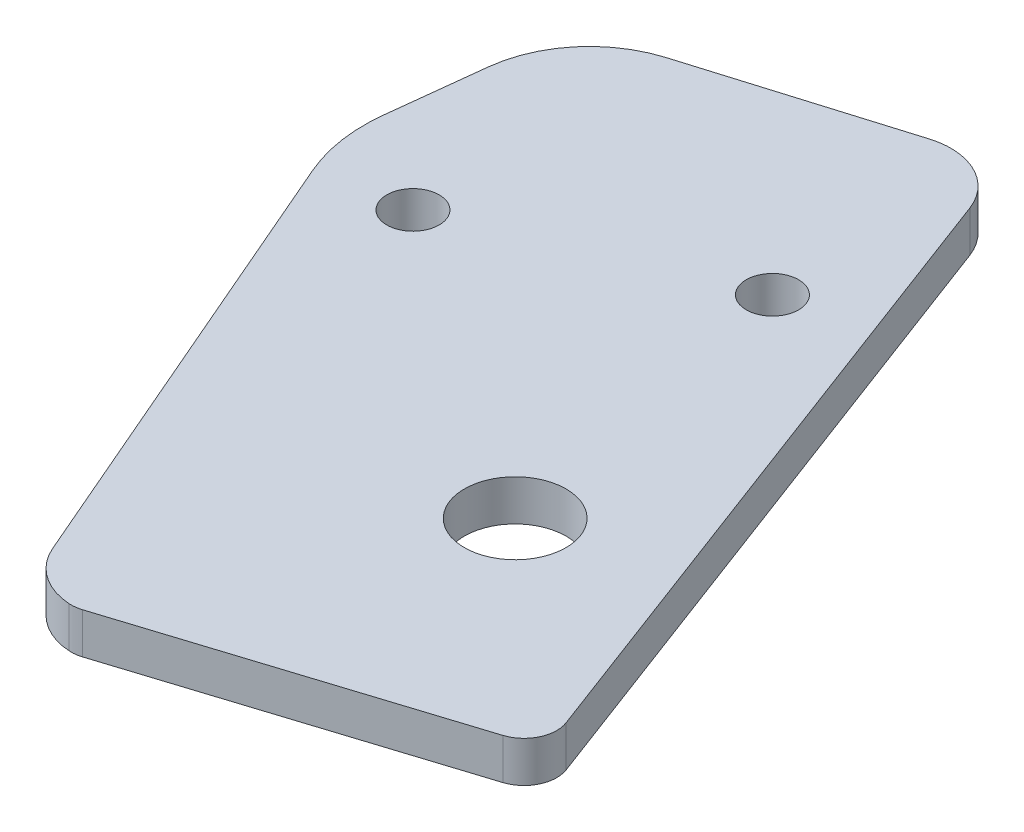
ISO-10303-21;
HEADER;
FILE_DESCRIPTION(('STEP AP214'),'2;1');
FILE_NAME('part.step','',(''),(''),'','','');
FILE_SCHEMA(('AUTOMOTIVE_DESIGN { 1 0 10303 214 1 1 1 1 }'));
ENDSEC;
DATA;
#1=APPLICATION_CONTEXT('core data for automotive mechanical design processes');
#2=APPLICATION_PROTOCOL_DEFINITION('international standard','automotive_design',2000,#1);
#3=PRODUCT_CONTEXT('',#1,'mechanical');
#4=PRODUCT('Part','Part','',(#3));
#5=PRODUCT_RELATED_PRODUCT_CATEGORY('part','',(#4));
#6=PRODUCT_DEFINITION_FORMATION('','',#4);
#7=PRODUCT_DEFINITION_CONTEXT('part definition',#1,'design');
#8=PRODUCT_DEFINITION('design','',#6,#7);
#9=PRODUCT_DEFINITION_SHAPE('','',#8);
#10=(LENGTH_UNIT() NAMED_UNIT(*) SI_UNIT(.MILLI.,.METRE.));
#11=(NAMED_UNIT(*) PLANE_ANGLE_UNIT() SI_UNIT($,.RADIAN.));
#12=(NAMED_UNIT(*) SI_UNIT($,.STERADIAN.) SOLID_ANGLE_UNIT());
#13=UNCERTAINTY_MEASURE_WITH_UNIT(LENGTH_MEASURE(1.E-05),#10,'distance_accuracy_value','');
#14=(GEOMETRIC_REPRESENTATION_CONTEXT(3) GLOBAL_UNCERTAINTY_ASSIGNED_CONTEXT((#13)) GLOBAL_UNIT_ASSIGNED_CONTEXT((#10,
#11,#12)) REPRESENTATION_CONTEXT('',''));
#15=CARTESIAN_POINT('',(0.,0.,0.));
#16=DIRECTION('',(0.,0.,1.));
#17=DIRECTION('',(1.,0.,0.));
#18=AXIS2_PLACEMENT_3D('',#15,#16,#17);
#19=CARTESIAN_POINT('',(0.,3.175,0.));
#20=DIRECTION('',(0.,1.,0.));
#21=DIRECTION('',(0.,0.,1.));
#22=AXIS2_PLACEMENT_3D('',#19,#20,#21);
#23=PLANE('',#22);
#24=CARTESIAN_POINT('',(-2.72391143677525,3.175,-9.48512316381565));
#25=DIRECTION('',(0.,-1.,0.));
#26=DIRECTION('',(0.,0.,-1.));
#27=AXIS2_PLACEMENT_3D('',#24,#25,#26);
#28=CIRCLE('',#27,3.95);
#29=CARTESIAN_POINT('',(-2.72391143677525,3.175,-13.4351231638156));
#30=VERTEX_POINT('',#29);
#31=EDGE_CURVE('E183',#30,#30,#28,.T.);
#32=ORIENTED_EDGE('',*,*,#31,.T.);
#33=EDGE_LOOP('',(#32));
#34=FACE_BOUND('',#33,.T.);
#35=CARTESIAN_POINT('',(-27.4348242736929,3.175,-26.2566941503502));
#36=DIRECTION('',(0.,-1.,0.));
#37=DIRECTION('',(0.,0.,-1.));
#38=AXIS2_PLACEMENT_3D('',#35,#36,#37);
#39=CIRCLE('',#38,2.032);
#40=CARTESIAN_POINT('',(-27.4348242736929,3.175,-28.2886941503502));
#41=VERTEX_POINT('',#40);
#42=EDGE_CURVE('E174',#41,#41,#39,.T.);
#43=ORIENTED_EDGE('',*,*,#42,.T.);
#44=EDGE_LOOP('',(#43));
#45=FACE_BOUND('',#44,.T.);
#46=CARTESIAN_POINT('',(-7.76493640593196,3.175,-34.5070552051682));
#47=DIRECTION('',(0.,-1.,0.));
#48=DIRECTION('',(0.,0.,-1.));
#49=AXIS2_PLACEMENT_3D('',#46,#47,#48);
#50=CIRCLE('',#49,2.03199999999999);
#51=CARTESIAN_POINT('',(-7.76493640593196,3.175,-36.5390552051682));
#52=VERTEX_POINT('',#51);
#53=EDGE_CURVE('E138',#52,#52,#50,.T.);
#54=ORIENTED_EDGE('',*,*,#53,.T.);
#55=EDGE_LOOP('',(#54));
#56=FACE_BOUND('',#55,.T.);
#57=DIRECTION('',(0.9530618054394,0.,-0.302775816426266));
#58=VECTOR('',#57,1.);
#59=CARTESIAN_POINT('',(2.66086977695026,3.175,8.37574606714643));
#60=LINE('',#59,#58);
#61=CARTESIAN_POINT('',(-13.3730568373587,3.175,13.4695240293513));
#62=VERTEX_POINT('',#61);
#63=CARTESIAN_POINT('',(11.3976631095826,3.175,5.60017608927313));
#64=VERTEX_POINT('',#63);
#65=EDGE_CURVE('E139',#62,#64,#60,.T.);
#66=ORIENTED_EDGE('',*,*,#65,.T.);
#67=CARTESIAN_POINT('',(10.6286125358599,3.175,3.17939910345706));
#68=DIRECTION('',(0.,1.,0.));
#69=DIRECTION('',(0.,0.,1.));
#70=AXIS2_PLACEMENT_3D('',#67,#68,#69);
#71=CIRCLE('',#70,2.54);
#72=CARTESIAN_POINT('',(13.0056344324065,3.175,2.28420811638324));
#73=VERTEX_POINT('',#72);
#74=EDGE_CURVE('E12',#64,#73,#71,.T.);
#75=ORIENTED_EDGE('',*,*,#74,.T.);
#76=DIRECTION('',(0.352437396485755,0.,0.935835392341166));
#77=VECTOR('',#76,1.);
#78=CARTESIAN_POINT('',(10.6367917652594,3.175,-4.0058360983023));
#79=LINE('',#78,#77);
#80=CARTESIAN_POINT('',(-5.93429697501374,3.175,-48.0074417377896));
#81=VERTEX_POINT('',#80);
#82=EDGE_CURVE('E175',#81,#73,#79,.T.);
#83=ORIENTED_EDGE('',*,*,#82,.F.);
#84=CARTESIAN_POINT('',(-10.6883407681069,3.175,-46.217059763642));
#85=DIRECTION('',(0.,-1.,0.));
#86=DIRECTION('',(0.,0.,-1.));
#87=AXIS2_PLACEMENT_3D('',#84,#85,#86);
#88=CIRCLE('',#87,5.08);
#89=CARTESIAN_POINT('',(-12.1585230397021,3.175,-51.0796685375705));
#90=VERTEX_POINT('',#89);
#91=EDGE_CURVE('E169',#90,#81,#88,.T.);
#92=ORIENTED_EDGE('',*,*,#91,.F.);
#93=DIRECTION('',(0.957206451560739,0.,-0.289405958975449));
#94=VECTOR('',#93,1.);
#95=CARTESIAN_POINT('',(-15.1685006161055,3.175,-50.1696188345276));
#96=LINE('',#95,#94);
#97=CARTESIAN_POINT('',(-27.8632506559036,3.175,-46.3314329309214));
#98=VERTEX_POINT('',#97);
#99=EDGE_CURVE('E168',#98,#90,#96,.T.);
#100=ORIENTED_EDGE('',*,*,#99,.F.);
#101=CARTESIAN_POINT('',(-25.2904316806118,3.175,-37.8218675765464));
#102=DIRECTION('',(0.,-1.,0.));
#103=DIRECTION('',(0.,0.,-1.));
#104=AXIS2_PLACEMENT_3D('',#101,#102,#103);
#105=CIRCLE('',#104,8.89);
#106=CARTESIAN_POINT('',(-34.123437376859,3.175,-38.8269100483179));
#107=VERTEX_POINT('',#106);
#108=EDGE_CURVE('E161',#107,#98,#105,.T.);
#109=ORIENTED_EDGE('',*,*,#108,.F.);
#110=DIRECTION('',(0.113053146430997,0.,-0.993588942210033));
#111=VECTOR('',#110,1.);
#112=CARTESIAN_POINT('',(-38.0486682299339,3.175,-4.32927690533198));
#113=LINE('',#112,#111);
#114=CARTESIAN_POINT('',(-34.9557957747417,3.175,-31.5115709693066));
#115=VERTEX_POINT('',#114);
#116=EDGE_CURVE('E159',#115,#107,#113,.T.);
#117=ORIENTED_EDGE('',*,*,#116,.F.);
#118=CARTESIAN_POINT('',(-22.3372162086743,3.175,-30.075796009633));
#119=DIRECTION('',(0.,-1.,0.));
#120=DIRECTION('',(0.,0.,-1.));
#121=AXIS2_PLACEMENT_3D('',#118,#119,#120);
#122=CIRCLE('',#121,12.7);
#123=CARTESIAN_POINT('',(-33.9977824734721,3.175,-25.0437790795881));
#124=VERTEX_POINT('',#123);
#125=EDGE_CURVE('E160',#124,#115,#122,.T.);
#126=ORIENTED_EDGE('',*,*,#125,.F.);
#127=DIRECTION('',(-0.39622180551535,0.,-0.918154823999829));
#128=VECTOR('',#127,1.);
#129=CARTESIAN_POINT('',(-19.5496615813976,3.175,8.43648805900831));
#130=LINE('',#129,#128);
#131=CARTESIAN_POINT('',(-18.6477304273271,3.175,10.5265104366221));
#132=VERTEX_POINT('',#131);
#133=EDGE_CURVE('E153',#132,#124,#130,.T.);
#134=ORIENTED_EDGE('',*,*,#133,.F.);
#135=CARTESIAN_POINT('',(-13.9835039214079,3.175,8.51370366460409));
#136=DIRECTION('',(0.,-1.,0.));
#137=DIRECTION('',(0.,0.,-1.));
#138=AXIS2_PLACEMENT_3D('',#135,#136,#137);
#139=CIRCLE('',#138,5.08000000000001);
#140=CARTESIAN_POINT('',(-14.3007109007549,3.175,13.5837904224667));
#141=VERTEX_POINT('',#140);
#142=EDGE_CURVE('E148',#141,#132,#139,.T.);
#143=ORIENTED_EDGE('',*,*,#142,.F.);
#144=CARTESIAN_POINT('',(-14.1421074110814,3.175,11.0487470435354));
#145=DIRECTION('',(0.,-1.,0.));
#146=DIRECTION('',(0.,0.,-1.));
#147=AXIS2_PLACEMENT_3D('',#144,#145,#146);
#148=CIRCLE('',#147,2.54);
#149=EDGE_CURVE('E134',#62,#141,#148,.T.);
#150=ORIENTED_EDGE('',*,*,#149,.F.);
#151=EDGE_LOOP('',(#66,#75,#83,#92,#100,#109,#117,#126,#134,#143,#150));
#152=FACE_BOUND('',#151,.T.);
#153=ADVANCED_FACE('F48',(#34,#45,#56,#152),#23,.T.);
#154=CARTESIAN_POINT('',(0.,0.,0.));
#155=DIRECTION('',(0.,1.,0.));
#156=DIRECTION('',(0.,0.,1.));
#157=AXIS2_PLACEMENT_3D('',#154,#155,#156);
#158=PLANE('',#157);
#159=CARTESIAN_POINT('',(-7.76493640593196,0.,-34.5070552051682));
#160=DIRECTION('',(0.,-1.,0.));
#161=DIRECTION('',(0.,0.,-1.));
#162=AXIS2_PLACEMENT_3D('',#159,#160,#161);
#163=CIRCLE('',#162,2.03199999999999);
#164=CARTESIAN_POINT('',(-7.76493640593196,0.,-36.5390552051682));
#165=VERTEX_POINT('',#164);
#166=EDGE_CURVE('E144',#165,#165,#163,.T.);
#167=ORIENTED_EDGE('',*,*,#166,.F.);
#168=EDGE_LOOP('',(#167));
#169=FACE_BOUND('',#168,.T.);
#170=CARTESIAN_POINT('',(-27.4348242736929,0.,-26.2566941503502));
#171=DIRECTION('',(0.,-1.,0.));
#172=DIRECTION('',(0.,0.,-1.));
#173=AXIS2_PLACEMENT_3D('',#170,#171,#172);
#174=CIRCLE('',#173,2.032);
#175=CARTESIAN_POINT('',(-27.4348242736929,0.,-28.2886941503502));
#176=VERTEX_POINT('',#175);
#177=EDGE_CURVE('E235',#176,#176,#174,.T.);
#178=ORIENTED_EDGE('',*,*,#177,.F.);
#179=EDGE_LOOP('',(#178));
#180=FACE_BOUND('',#179,.T.);
#181=CARTESIAN_POINT('',(-2.72391143677525,0.,-9.48512316381565));
#182=DIRECTION('',(0.,-1.,0.));
#183=DIRECTION('',(0.,0.,-1.));
#184=AXIS2_PLACEMENT_3D('',#181,#182,#183);
#185=CIRCLE('',#184,3.95);
#186=CARTESIAN_POINT('',(-2.72391143677525,0.,-13.4351231638156));
#187=VERTEX_POINT('',#186);
#188=EDGE_CURVE('E241',#187,#187,#185,.T.);
#189=ORIENTED_EDGE('',*,*,#188,.F.);
#190=EDGE_LOOP('',(#189));
#191=FACE_BOUND('',#190,.T.);
#192=DIRECTION('',(0.352437396485755,0.,0.935835392341166));
#193=VECTOR('',#192,1.);
#194=CARTESIAN_POINT('',(10.6367917652594,0.,-4.0058360983023));
#195=LINE('',#194,#193);
#196=CARTESIAN_POINT('',(-5.93429697501374,0.,-48.0074417377896));
#197=VERTEX_POINT('',#196);
#198=CARTESIAN_POINT('',(13.0056344324065,0.,2.28420811638324));
#199=VERTEX_POINT('',#198);
#200=EDGE_CURVE('E226',#197,#199,#195,.T.);
#201=ORIENTED_EDGE('',*,*,#200,.T.);
#202=CARTESIAN_POINT('',(10.6286125358599,0.,3.17939910345706));
#203=DIRECTION('',(0.,1.,0.));
#204=DIRECTION('',(0.,0.,1.));
#205=AXIS2_PLACEMENT_3D('',#202,#203,#204);
#206=CIRCLE('',#205,2.54);
#207=CARTESIAN_POINT('',(11.3976631095826,0.,5.60017608927313));
#208=VERTEX_POINT('',#207);
#209=EDGE_CURVE('E67',#199,#208,#206,.F.);
#210=ORIENTED_EDGE('',*,*,#209,.T.);
#211=DIRECTION('',(0.9530618054394,0.,-0.302775816426266));
#212=VECTOR('',#211,1.);
#213=CARTESIAN_POINT('',(2.66086977695026,0.,8.37574606714643));
#214=LINE('',#213,#212);
#215=CARTESIAN_POINT('',(-13.3730568373587,0.,13.4695240293513));
#216=VERTEX_POINT('',#215);
#217=EDGE_CURVE('E179',#216,#208,#214,.T.);
#218=ORIENTED_EDGE('',*,*,#217,.F.);
#219=CARTESIAN_POINT('',(-14.1421074110814,0.,11.0487470435354));
#220=DIRECTION('',(0.,-1.,0.));
#221=DIRECTION('',(0.,0.,-1.));
#222=AXIS2_PLACEMENT_3D('',#219,#220,#221);
#223=CIRCLE('',#222,2.54);
#224=CARTESIAN_POINT('',(-14.3007109007549,0.,13.5837904224667));
#225=VERTEX_POINT('',#224);
#226=EDGE_CURVE('E136',#216,#225,#223,.T.);
#227=ORIENTED_EDGE('',*,*,#226,.T.);
#228=CARTESIAN_POINT('',(-13.9835039214079,0.,8.51370366460409));
#229=DIRECTION('',(0.,-1.,0.));
#230=DIRECTION('',(0.,0.,-1.));
#231=AXIS2_PLACEMENT_3D('',#228,#229,#230);
#232=CIRCLE('',#231,5.08000000000001);
#233=CARTESIAN_POINT('',(-18.6477304273271,0.,10.5265104366221));
#234=VERTEX_POINT('',#233);
#235=EDGE_CURVE('E198',#225,#234,#232,.T.);
#236=ORIENTED_EDGE('',*,*,#235,.T.);
#237=DIRECTION('',(-0.39622180551535,0.,-0.918154823999829));
#238=VECTOR('',#237,1.);
#239=CARTESIAN_POINT('',(-19.5496615813976,0.,8.43648805900831));
#240=LINE('',#239,#238);
#241=CARTESIAN_POINT('',(-33.9977824734721,0.,-25.0437790795881));
#242=VERTEX_POINT('',#241);
#243=EDGE_CURVE('E197',#234,#242,#240,.T.);
#244=ORIENTED_EDGE('',*,*,#243,.T.);
#245=CARTESIAN_POINT('',(-22.3372162086743,0.,-30.075796009633));
#246=DIRECTION('',(0.,-1.,0.));
#247=DIRECTION('',(0.,0.,-1.));
#248=AXIS2_PLACEMENT_3D('',#245,#246,#247);
#249=CIRCLE('',#248,12.7);
#250=CARTESIAN_POINT('',(-34.9557957747417,0.,-31.5115709693066));
#251=VERTEX_POINT('',#250);
#252=EDGE_CURVE('E204',#242,#251,#249,.T.);
#253=ORIENTED_EDGE('',*,*,#252,.T.);
#254=DIRECTION('',(0.113053146430997,0.,-0.993588942210033));
#255=VECTOR('',#254,1.);
#256=CARTESIAN_POINT('',(-38.0486682299339,0.,-4.32927690533198));
#257=LINE('',#256,#255);
#258=CARTESIAN_POINT('',(-34.123437376859,0.,-38.8269100483179));
#259=VERTEX_POINT('',#258);
#260=EDGE_CURVE('E208',#251,#259,#257,.T.);
#261=ORIENTED_EDGE('',*,*,#260,.T.);
#262=CARTESIAN_POINT('',(-25.2904316806118,0.,-37.8218675765464));
#263=DIRECTION('',(0.,-1.,0.));
#264=DIRECTION('',(0.,0.,-1.));
#265=AXIS2_PLACEMENT_3D('',#262,#263,#264);
#266=CIRCLE('',#265,8.89);
#267=CARTESIAN_POINT('',(-27.8632506559036,0.,-46.3314329309214));
#268=VERTEX_POINT('',#267);
#269=EDGE_CURVE('E218',#259,#268,#266,.T.);
#270=ORIENTED_EDGE('',*,*,#269,.T.);
#271=DIRECTION('',(0.957206451560739,0.,-0.289405958975449));
#272=VECTOR('',#271,1.);
#273=CARTESIAN_POINT('',(-15.1685006161055,0.,-50.1696188345276));
#274=LINE('',#273,#272);
#275=CARTESIAN_POINT('',(-12.1585230397021,0.,-51.0796685375705));
#276=VERTEX_POINT('',#275);
#277=EDGE_CURVE('E217',#268,#276,#274,.T.);
#278=ORIENTED_EDGE('',*,*,#277,.T.);
#279=CARTESIAN_POINT('',(-10.6883407681069,0.,-46.217059763642));
#280=DIRECTION('',(0.,-1.,0.));
#281=DIRECTION('',(0.,0.,-1.));
#282=AXIS2_PLACEMENT_3D('',#279,#280,#281);
#283=CIRCLE('',#282,5.08);
#284=EDGE_CURVE('E222',#276,#197,#283,.T.);
#285=ORIENTED_EDGE('',*,*,#284,.T.);
#286=EDGE_LOOP('',(#201,#210,#218,#227,#236,#244,#253,#261,#270,#278,#285));
#287=FACE_BOUND('',#286,.T.);
#288=ADVANCED_FACE('F259',(#169,#180,#191,#287),#158,.F.);
#289=CARTESIAN_POINT('',(10.6367917652594,3.175,-4.0058360983023));
#290=DIRECTION('',(0.935835392341166,0.,-0.352437396485755));
#291=DIRECTION('',(-0.352437396485755,0.,-0.935835392341166));
#292=AXIS2_PLACEMENT_3D('',#289,#290,#291);
#293=PLANE('',#292);
#294=ORIENTED_EDGE('',*,*,#82,.T.);
#295=DIRECTION('',(0.,-1.,0.));
#296=VECTOR('',#295,1.);
#297=CARTESIAN_POINT('',(13.0056344324065,0.,2.28420811638324));
#298=LINE('',#297,#296);
#299=EDGE_CURVE('E267',#73,#199,#298,.T.);
#300=ORIENTED_EDGE('',*,*,#299,.T.);
#301=ORIENTED_EDGE('',*,*,#200,.F.);
#302=DIRECTION('',(0.,-1.,0.));
#303=VECTOR('',#302,1.);
#304=CARTESIAN_POINT('',(-5.93429697501374,3.175,-48.0074417377896));
#305=LINE('',#304,#303);
#306=EDGE_CURVE('E266',#81,#197,#305,.T.);
#307=ORIENTED_EDGE('',*,*,#306,.F.);
#308=EDGE_LOOP('',(#294,#300,#301,#307));
#309=FACE_BOUND('',#308,.T.);
#310=ADVANCED_FACE('F260',(#309),#293,.T.);
#311=CARTESIAN_POINT('',(-10.6883407681069,3.175,-46.217059763642));
#312=DIRECTION('',(0.,-1.,0.));
#313=DIRECTION('',(0.,0.,-1.));
#314=AXIS2_PLACEMENT_3D('',#311,#312,#313);
#315=CYLINDRICAL_SURFACE('',#314,5.08);
#316=ORIENTED_EDGE('',*,*,#284,.F.);
#317=DIRECTION('',(0.,-1.,0.));
#318=VECTOR('',#317,1.);
#319=CARTESIAN_POINT('',(-12.1585230397021,3.175,-51.0796685375705));
#320=LINE('',#319,#318);
#321=EDGE_CURVE('E274',#90,#276,#320,.T.);
#322=ORIENTED_EDGE('',*,*,#321,.F.);
#323=ORIENTED_EDGE('',*,*,#91,.T.);
#324=ORIENTED_EDGE('',*,*,#306,.T.);
#325=EDGE_LOOP('',(#316,#322,#323,#324));
#326=FACE_BOUND('',#325,.T.);
#327=ADVANCED_FACE('F291',(#326),#315,.T.);
#328=CARTESIAN_POINT('',(-15.1685006161055,3.175,-50.1696188345276));
#329=DIRECTION('',(-0.289405958975449,0.,-0.957206451560738));
#330=DIRECTION('',(-0.957206451560739,0.,0.289405958975449));
#331=AXIS2_PLACEMENT_3D('',#328,#329,#330);
#332=PLANE('',#331);
#333=ORIENTED_EDGE('',*,*,#277,.F.);
#334=DIRECTION('',(0.,-1.,0.));
#335=VECTOR('',#334,1.);
#336=CARTESIAN_POINT('',(-27.8632506559036,3.175,-46.3314329309214));
#337=LINE('',#336,#335);
#338=EDGE_CURVE('E282',#98,#268,#337,.T.);
#339=ORIENTED_EDGE('',*,*,#338,.F.);
#340=ORIENTED_EDGE('',*,*,#99,.T.);
#341=ORIENTED_EDGE('',*,*,#321,.T.);
#342=EDGE_LOOP('',(#333,#339,#340,#341));
#343=FACE_BOUND('',#342,.T.);
#344=ADVANCED_FACE('F287',(#343),#332,.T.);
#345=CARTESIAN_POINT('',(-25.2904316806118,3.175,-37.8218675765464));
#346=DIRECTION('',(0.,-1.,0.));
#347=DIRECTION('',(0.,0.,-1.));
#348=AXIS2_PLACEMENT_3D('',#345,#346,#347);
#349=CYLINDRICAL_SURFACE('',#348,8.89);
#350=ORIENTED_EDGE('',*,*,#269,.F.);
#351=DIRECTION('',(0.,-1.,0.));
#352=VECTOR('',#351,1.);
#353=CARTESIAN_POINT('',(-34.123437376859,3.175,-38.8269100483179));
#354=LINE('',#353,#352);
#355=EDGE_CURVE('E281',#107,#259,#354,.T.);
#356=ORIENTED_EDGE('',*,*,#355,.F.);
#357=ORIENTED_EDGE('',*,*,#108,.T.);
#358=ORIENTED_EDGE('',*,*,#338,.T.);
#359=EDGE_LOOP('',(#350,#356,#357,#358));
#360=FACE_BOUND('',#359,.T.);
#361=ADVANCED_FACE('F296',(#360),#349,.T.);
#362=CARTESIAN_POINT('',(-38.0486682299339,3.175,-4.32927690533198));
#363=DIRECTION('',(-0.993588942210032,0.,-0.113053146430997));
#364=DIRECTION('',(-0.113053146430997,0.,0.993588942210033));
#365=AXIS2_PLACEMENT_3D('',#362,#363,#364);
#366=PLANE('',#365);
#367=ORIENTED_EDGE('',*,*,#260,.F.);
#368=DIRECTION('',(0.,-1.,0.));
#369=VECTOR('',#368,1.);
#370=CARTESIAN_POINT('',(-34.9557957747417,3.175,-31.5115709693066));
#371=LINE('',#370,#369);
#372=EDGE_CURVE('E283',#115,#251,#371,.T.);
#373=ORIENTED_EDGE('',*,*,#372,.F.);
#374=ORIENTED_EDGE('',*,*,#116,.T.);
#375=ORIENTED_EDGE('',*,*,#355,.T.);
#376=EDGE_LOOP('',(#367,#373,#374,#375));
#377=FACE_BOUND('',#376,.T.);
#378=ADVANCED_FACE('F325',(#377),#366,.T.);
#379=CARTESIAN_POINT('',(-22.3372162086743,3.175,-30.075796009633));
#380=DIRECTION('',(0.,-1.,0.));
#381=DIRECTION('',(0.,0.,-1.));
#382=AXIS2_PLACEMENT_3D('',#379,#380,#381);
#383=CYLINDRICAL_SURFACE('',#382,12.7);
#384=ORIENTED_EDGE('',*,*,#252,.F.);
#385=DIRECTION('',(0.,-1.,0.));
#386=VECTOR('',#385,1.);
#387=CARTESIAN_POINT('',(-33.9977824734721,3.175,-25.0437790795881));
#388=LINE('',#387,#386);
#389=EDGE_CURVE('E278',#124,#242,#388,.T.);
#390=ORIENTED_EDGE('',*,*,#389,.F.);
#391=ORIENTED_EDGE('',*,*,#125,.T.);
#392=ORIENTED_EDGE('',*,*,#372,.T.);
#393=EDGE_LOOP('',(#384,#390,#391,#392));
#394=FACE_BOUND('',#393,.T.);
#395=ADVANCED_FACE('F321',(#394),#383,.T.);
#396=CARTESIAN_POINT('',(-19.5496615813976,3.175,8.43648805900831));
#397=DIRECTION('',(-0.918154823999829,0.,0.39622180551535));
#398=DIRECTION('',(0.39622180551535,0.,0.918154823999829));
#399=AXIS2_PLACEMENT_3D('',#396,#397,#398);
#400=PLANE('',#399);
#401=ORIENTED_EDGE('',*,*,#243,.F.);
#402=DIRECTION('',(0.,-1.,0.));
#403=VECTOR('',#402,1.);
#404=CARTESIAN_POINT('',(-18.6477304273271,3.175,10.5265104366221));
#405=LINE('',#404,#403);
#406=EDGE_CURVE('E277',#132,#234,#405,.T.);
#407=ORIENTED_EDGE('',*,*,#406,.F.);
#408=ORIENTED_EDGE('',*,*,#133,.T.);
#409=ORIENTED_EDGE('',*,*,#389,.T.);
#410=EDGE_LOOP('',(#401,#407,#408,#409));
#411=FACE_BOUND('',#410,.T.);
#412=ADVANCED_FACE('F320',(#411),#400,.T.);
#413=CARTESIAN_POINT('',(-13.9835039214079,3.175,8.51370366460409));
#414=DIRECTION('',(0.,-1.,0.));
#415=DIRECTION('',(0.,0.,-1.));
#416=AXIS2_PLACEMENT_3D('',#413,#414,#415);
#417=CYLINDRICAL_SURFACE('',#416,5.08000000000001);
#418=ORIENTED_EDGE('',*,*,#235,.F.);
#419=DIRECTION('',(0.,-1.,0.));
#420=VECTOR('',#419,1.);
#421=CARTESIAN_POINT('',(-14.3007109007549,3.175,13.5837904224667));
#422=LINE('',#421,#420);
#423=EDGE_CURVE('E140',#141,#225,#422,.T.);
#424=ORIENTED_EDGE('',*,*,#423,.F.);
#425=ORIENTED_EDGE('',*,*,#142,.T.);
#426=ORIENTED_EDGE('',*,*,#406,.T.);
#427=EDGE_LOOP('',(#418,#424,#425,#426));
#428=FACE_BOUND('',#427,.T.);
#429=ADVANCED_FACE('F313',(#428),#417,.T.);
#430=CARTESIAN_POINT('',(-14.1421074110814,3.175,11.0487470435354));
#431=DIRECTION('',(0.,-1.,0.));
#432=DIRECTION('',(0.,0.,-1.));
#433=AXIS2_PLACEMENT_3D('',#430,#431,#432);
#434=CYLINDRICAL_SURFACE('',#433,2.54);
#435=ORIENTED_EDGE('',*,*,#226,.F.);
#436=DIRECTION('',(0.,-1.,0.));
#437=VECTOR('',#436,1.);
#438=CARTESIAN_POINT('',(-13.3730568373587,3.175,13.4695240293513));
#439=LINE('',#438,#437);
#440=EDGE_CURVE('E133',#62,#216,#439,.T.);
#441=ORIENTED_EDGE('',*,*,#440,.F.);
#442=ORIENTED_EDGE('',*,*,#149,.T.);
#443=ORIENTED_EDGE('',*,*,#423,.T.);
#444=EDGE_LOOP('',(#435,#441,#442,#443));
#445=FACE_BOUND('',#444,.T.);
#446=ADVANCED_FACE('F135',(#445),#434,.T.);
#447=CARTESIAN_POINT('',(2.66086977695026,3.175,8.37574606714643));
#448=DIRECTION('',(-0.302775816426266,0.,-0.9530618054394));
#449=DIRECTION('',(-0.9530618054394,0.,0.302775816426266));
#450=AXIS2_PLACEMENT_3D('',#447,#448,#449);
#451=PLANE('',#450);
#452=ORIENTED_EDGE('',*,*,#217,.T.);
#453=DIRECTION('',(0.,-1.,0.));
#454=VECTOR('',#453,1.);
#455=CARTESIAN_POINT('',(11.3976631095826,3.175,5.60017608927313));
#456=LINE('',#455,#454);
#457=EDGE_CURVE('E57',#208,#64,#456,.F.);
#458=ORIENTED_EDGE('',*,*,#457,.T.);
#459=ORIENTED_EDGE('',*,*,#65,.F.);
#460=ORIENTED_EDGE('',*,*,#440,.T.);
#461=EDGE_LOOP('',(#452,#458,#459,#460));
#462=FACE_BOUND('',#461,.T.);
#463=ADVANCED_FACE('F142',(#462),#451,.F.);
#464=CARTESIAN_POINT('',(-27.4348242736929,3.175,-26.2566941503502));
#465=DIRECTION('',(0.,-1.,0.));
#466=DIRECTION('',(0.,0.,-1.));
#467=AXIS2_PLACEMENT_3D('',#464,#465,#466);
#468=CYLINDRICAL_SURFACE('',#467,2.032);
#469=ORIENTED_EDGE('',*,*,#42,.F.);
#470=EDGE_LOOP('',(#469));
#471=FACE_BOUND('',#470,.T.);
#472=ORIENTED_EDGE('',*,*,#177,.T.);
#473=EDGE_LOOP('',(#472));
#474=FACE_BOUND('',#473,.T.);
#475=ADVANCED_FACE('F311',(#471,#474),#468,.F.);
#476=CARTESIAN_POINT('',(-7.76493640593196,3.175,-34.5070552051682));
#477=DIRECTION('',(0.,-1.,0.));
#478=DIRECTION('',(0.,0.,-1.));
#479=AXIS2_PLACEMENT_3D('',#476,#477,#478);
#480=CYLINDRICAL_SURFACE('',#479,2.03199999999999);
#481=ORIENTED_EDGE('',*,*,#53,.F.);
#482=EDGE_LOOP('',(#481));
#483=FACE_BOUND('',#482,.T.);
#484=ORIENTED_EDGE('',*,*,#166,.T.);
#485=EDGE_LOOP('',(#484));
#486=FACE_BOUND('',#485,.T.);
#487=ADVANCED_FACE('F251',(#483,#486),#480,.F.);
#488=CARTESIAN_POINT('',(-2.72391143677525,3.175,-9.48512316381565));
#489=DIRECTION('',(0.,-1.,0.));
#490=DIRECTION('',(0.,0.,-1.));
#491=AXIS2_PLACEMENT_3D('',#488,#489,#490);
#492=CYLINDRICAL_SURFACE('',#491,3.95);
#493=ORIENTED_EDGE('',*,*,#31,.F.);
#494=EDGE_LOOP('',(#493));
#495=FACE_BOUND('',#494,.T.);
#496=ORIENTED_EDGE('',*,*,#188,.T.);
#497=EDGE_LOOP('',(#496));
#498=FACE_BOUND('',#497,.T.);
#499=ADVANCED_FACE('F252',(#495,#498),#492,.F.);
#500=CARTESIAN_POINT('',(10.6286125358599,3.175,3.17939910345706));
#501=DIRECTION('',(0.,1.,0.));
#502=DIRECTION('',(0.,0.,1.));
#503=AXIS2_PLACEMENT_3D('',#500,#501,#502);
#504=CYLINDRICAL_SURFACE('',#503,2.54);
#505=ORIENTED_EDGE('',*,*,#74,.F.);
#506=ORIENTED_EDGE('',*,*,#457,.F.);
#507=ORIENTED_EDGE('',*,*,#209,.F.);
#508=ORIENTED_EDGE('',*,*,#299,.F.);
#509=EDGE_LOOP('',(#505,#506,#507,#508));
#510=FACE_BOUND('',#509,.T.);
#511=ADVANCED_FACE('F49',(#510),#504,.T.);
#512=CLOSED_SHELL('',(#153,#288,#310,#327,#344,#361,#378,#395,#412,#429,#446,#463,#475,#487,
#499,#511));
#513=MANIFOLD_SOLID_BREP('B2',#512);
#514=ADVANCED_BREP_SHAPE_REPRESENTATION('',(#18,#513),#14);
#515=SHAPE_DEFINITION_REPRESENTATION(#9,#514);
ENDSEC;
END-ISO-10303-21;
